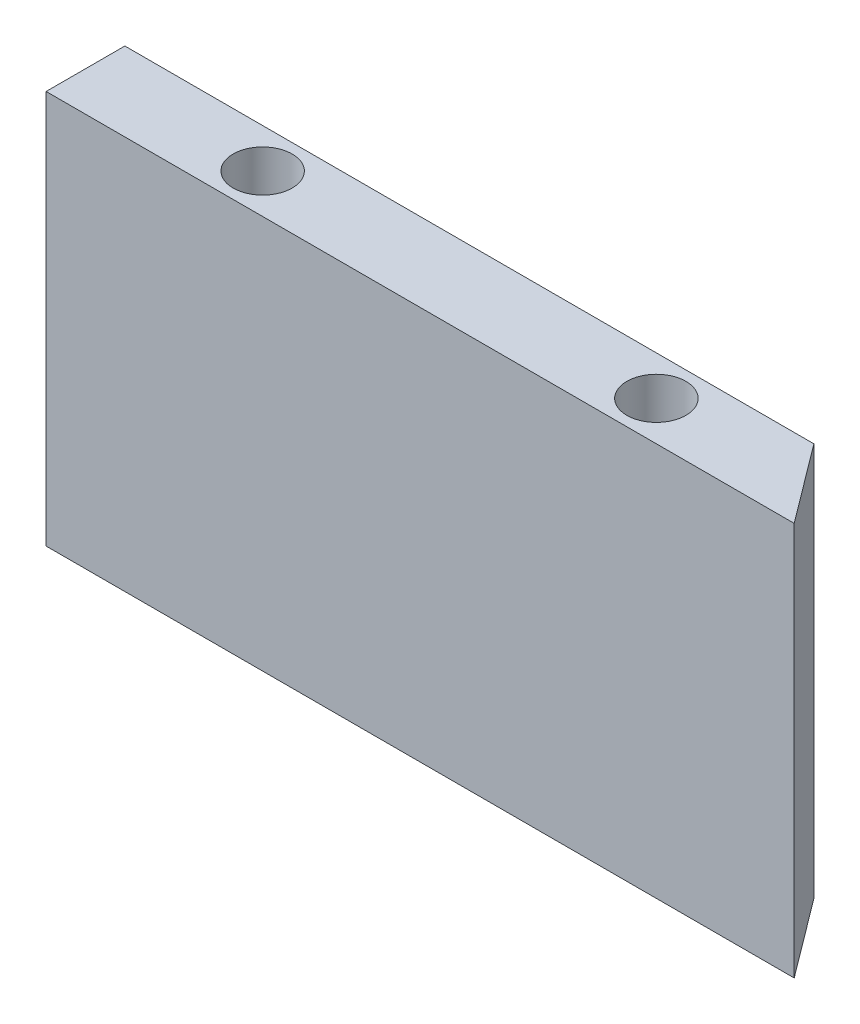
ISO-10303-21;
HEADER;
FILE_DESCRIPTION(('STEP AP214'),'2;1');
FILE_NAME('part.step','',(''),(''),'','','');
FILE_SCHEMA(('AUTOMOTIVE_DESIGN { 1 0 10303 214 1 1 1 1 }'));
ENDSEC;
DATA;
#1=APPLICATION_CONTEXT('core data for automotive mechanical design processes');
#2=APPLICATION_PROTOCOL_DEFINITION('international standard','automotive_design',2000,#1);
#3=PRODUCT_CONTEXT('',#1,'mechanical');
#4=PRODUCT('Part','Part','',(#3));
#5=PRODUCT_RELATED_PRODUCT_CATEGORY('part','',(#4));
#6=PRODUCT_DEFINITION_FORMATION('','',#4);
#7=PRODUCT_DEFINITION_CONTEXT('part definition',#1,'design');
#8=PRODUCT_DEFINITION('design','',#6,#7);
#9=PRODUCT_DEFINITION_SHAPE('','',#8);
#10=(LENGTH_UNIT() NAMED_UNIT(*) SI_UNIT(.MILLI.,.METRE.));
#11=(NAMED_UNIT(*) PLANE_ANGLE_UNIT() SI_UNIT($,.RADIAN.));
#12=(NAMED_UNIT(*) SI_UNIT($,.STERADIAN.) SOLID_ANGLE_UNIT());
#13=UNCERTAINTY_MEASURE_WITH_UNIT(LENGTH_MEASURE(1.E-05),#10,'distance_accuracy_value','');
#14=(GEOMETRIC_REPRESENTATION_CONTEXT(3) GLOBAL_UNCERTAINTY_ASSIGNED_CONTEXT((#13)) GLOBAL_UNIT_ASSIGNED_CONTEXT((#10,
#11,#12)) REPRESENTATION_CONTEXT('',''));
#15=CARTESIAN_POINT('',(0.,0.,0.));
#16=DIRECTION('',(0.,0.,1.));
#17=DIRECTION('',(1.,0.,0.));
#18=AXIS2_PLACEMENT_3D('',#15,#16,#17);
#19=CARTESIAN_POINT('',(424.562385163869,508.,-50.8000000000001));
#20=DIRECTION('',(0.800000000000001,0.,-0.599999999999999));
#21=DIRECTION('',(-0.599999999999999,0.,-0.800000000000001));
#22=AXIS2_PLACEMENT_3D('',#19,#20,#21);
#23=PLANE('',#22);
#24=DIRECTION('',(0.599999999999999,0.,0.800000000000001));
#25=VECTOR('',#24,1.);
#26=CARTESIAN_POINT('',(424.562385163869,0.,-50.8000000000001));
#27=LINE('',#26,#25);
#28=CARTESIAN_POINT('',(424.562385163869,0.,-50.8000000000001));
#29=VERTEX_POINT('',#28);
#30=CARTESIAN_POINT('',(500.762385163869,0.,50.8000000000002));
#31=VERTEX_POINT('',#30);
#32=EDGE_CURVE('E110',#29,#31,#27,.T.);
#33=ORIENTED_EDGE('',*,*,#32,.F.);
#34=DIRECTION('',(0.,-1.,0.));
#35=VECTOR('',#34,1.);
#36=CARTESIAN_POINT('',(424.562385163869,508.,-50.8000000000001));
#37=LINE('',#36,#35);
#38=CARTESIAN_POINT('',(424.562385163869,508.,-50.8000000000001));
#39=VERTEX_POINT('',#38);
#40=EDGE_CURVE('E11',#39,#29,#37,.T.);
#41=ORIENTED_EDGE('',*,*,#40,.F.);
#42=DIRECTION('',(0.599999999999999,0.,0.800000000000001));
#43=VECTOR('',#42,1.);
#44=CARTESIAN_POINT('',(424.562385163869,508.,-50.8000000000001));
#45=LINE('',#44,#43);
#46=CARTESIAN_POINT('',(500.762385163869,508.,50.8000000000002));
#47=VERTEX_POINT('',#46);
#48=EDGE_CURVE('E101',#39,#47,#45,.T.);
#49=ORIENTED_EDGE('',*,*,#48,.T.);
#50=DIRECTION('',(0.,-1.,0.));
#51=VECTOR('',#50,1.);
#52=CARTESIAN_POINT('',(500.762385163869,508.,50.8000000000002));
#53=LINE('',#52,#51);
#54=EDGE_CURVE('E42',#47,#31,#53,.T.);
#55=ORIENTED_EDGE('',*,*,#54,.T.);
#56=EDGE_LOOP('',(#33,#41,#49,#55));
#57=FACE_BOUND('',#56,.T.);
#58=ADVANCED_FACE('F39',(#57),#23,.T.);
#59=CARTESIAN_POINT('',(-464.437614836131,508.,-50.8));
#60=DIRECTION('',(0.,0.,-1.));
#61=DIRECTION('',(-1.,0.,0.));
#62=AXIS2_PLACEMENT_3D('',#59,#60,#61);
#63=PLANE('',#62);
#64=DIRECTION('',(1.,0.,0.));
#65=VECTOR('',#64,1.);
#66=CARTESIAN_POINT('',(-464.437614836131,0.,-50.8));
#67=LINE('',#66,#65);
#68=CARTESIAN_POINT('',(-464.437614836131,0.,-50.8));
#69=VERTEX_POINT('',#68);
#70=EDGE_CURVE('E104',#69,#29,#67,.T.);
#71=ORIENTED_EDGE('',*,*,#70,.F.);
#72=DIRECTION('',(0.,-1.,0.));
#73=VECTOR('',#72,1.);
#74=CARTESIAN_POINT('',(-464.437614836131,508.,-50.8));
#75=LINE('',#74,#73);
#76=CARTESIAN_POINT('',(-464.437614836131,508.,-50.8));
#77=VERTEX_POINT('',#76);
#78=EDGE_CURVE('E49',#77,#69,#75,.T.);
#79=ORIENTED_EDGE('',*,*,#78,.F.);
#80=DIRECTION('',(1.,0.,0.));
#81=VECTOR('',#80,1.);
#82=CARTESIAN_POINT('',(-464.437614836131,508.,-50.8));
#83=LINE('',#82,#81);
#84=EDGE_CURVE('E96',#77,#39,#83,.T.);
#85=ORIENTED_EDGE('',*,*,#84,.T.);
#86=ORIENTED_EDGE('',*,*,#40,.T.);
#87=EDGE_LOOP('',(#71,#79,#85,#86));
#88=FACE_BOUND('',#87,.T.);
#89=ADVANCED_FACE('F127',(#88),#63,.T.);
#90=CARTESIAN_POINT('',(-464.437614836131,508.,50.8000000000002));
#91=DIRECTION('',(-1.,0.,0.));
#92=DIRECTION('',(0.,0.,1.));
#93=AXIS2_PLACEMENT_3D('',#90,#91,#92);
#94=PLANE('',#93);
#95=DIRECTION('',(0.,0.,-1.));
#96=VECTOR('',#95,1.);
#97=CARTESIAN_POINT('',(-464.437614836131,0.,50.8000000000002));
#98=LINE('',#97,#96);
#99=CARTESIAN_POINT('',(-464.437614836131,0.,50.8000000000002));
#100=VERTEX_POINT('',#99);
#101=EDGE_CURVE('E90',#100,#69,#98,.T.);
#102=ORIENTED_EDGE('',*,*,#101,.F.);
#103=DIRECTION('',(0.,-1.,0.));
#104=VECTOR('',#103,1.);
#105=CARTESIAN_POINT('',(-464.437614836131,508.,50.8000000000002));
#106=LINE('',#105,#104);
#107=CARTESIAN_POINT('',(-464.437614836131,508.,50.8000000000002));
#108=VERTEX_POINT('',#107);
#109=EDGE_CURVE('E85',#108,#100,#106,.T.);
#110=ORIENTED_EDGE('',*,*,#109,.F.);
#111=DIRECTION('',(0.,0.,-1.));
#112=VECTOR('',#111,1.);
#113=CARTESIAN_POINT('',(-464.437614836131,508.,50.8000000000002));
#114=LINE('',#113,#112);
#115=EDGE_CURVE('E88',#108,#77,#114,.T.);
#116=ORIENTED_EDGE('',*,*,#115,.T.);
#117=ORIENTED_EDGE('',*,*,#78,.T.);
#118=EDGE_LOOP('',(#102,#110,#116,#117));
#119=FACE_BOUND('',#118,.T.);
#120=ADVANCED_FACE('F87',(#119),#94,.T.);
#121=CARTESIAN_POINT('',(500.762385163869,508.,50.8000000000002));
#122=DIRECTION('',(0.,0.,1.));
#123=DIRECTION('',(1.,0.,0.));
#124=AXIS2_PLACEMENT_3D('',#121,#122,#123);
#125=PLANE('',#124);
#126=DIRECTION('',(-1.,0.,0.));
#127=VECTOR('',#126,1.);
#128=CARTESIAN_POINT('',(500.762385163869,0.,50.8000000000002));
#129=LINE('',#128,#127);
#130=EDGE_CURVE('E114',#31,#100,#129,.T.);
#131=ORIENTED_EDGE('',*,*,#130,.F.);
#132=ORIENTED_EDGE('',*,*,#54,.F.);
#133=DIRECTION('',(-1.,0.,0.));
#134=VECTOR('',#133,1.);
#135=CARTESIAN_POINT('',(500.762385163869,508.,50.8000000000002));
#136=LINE('',#135,#134);
#137=EDGE_CURVE('E95',#47,#108,#136,.T.);
#138=ORIENTED_EDGE('',*,*,#137,.T.);
#139=ORIENTED_EDGE('',*,*,#109,.T.);
#140=EDGE_LOOP('',(#131,#132,#138,#139));
#141=FACE_BOUND('',#140,.T.);
#142=ADVANCED_FACE('F99',(#141),#125,.T.);
#143=CARTESIAN_POINT('',(0.,508.,0.));
#144=DIRECTION('',(0.,-1.,0.));
#145=DIRECTION('',(0.,0.,-1.));
#146=AXIS2_PLACEMENT_3D('',#143,#144,#145);
#147=PLANE('',#146);
#148=CARTESIAN_POINT('',(-235.837614836131,508.,0.));
#149=DIRECTION('',(0.,1.,0.));
#150=DIRECTION('',(0.,0.,1.));
#151=AXIS2_PLACEMENT_3D('',#148,#149,#150);
#152=CIRCLE('',#151,38.1);
#153=CARTESIAN_POINT('',(-235.837614836131,508.,38.1));
#154=VERTEX_POINT('',#153);
#155=EDGE_CURVE('E207',#154,#154,#152,.T.);
#156=ORIENTED_EDGE('',*,*,#155,.F.);
#157=EDGE_LOOP('',(#156));
#158=FACE_BOUND('',#157,.T.);
#159=CARTESIAN_POINT('',(272.162385163869,508.,0.));
#160=DIRECTION('',(0.,1.,0.));
#161=DIRECTION('',(0.,0.,1.));
#162=AXIS2_PLACEMENT_3D('',#159,#160,#161);
#163=CIRCLE('',#162,38.1);
#164=CARTESIAN_POINT('',(272.162385163869,508.,38.1));
#165=VERTEX_POINT('',#164);
#166=EDGE_CURVE('E186',#165,#165,#163,.T.);
#167=ORIENTED_EDGE('',*,*,#166,.F.);
#168=EDGE_LOOP('',(#167));
#169=FACE_BOUND('',#168,.T.);
#170=ORIENTED_EDGE('',*,*,#48,.F.);
#171=ORIENTED_EDGE('',*,*,#84,.F.);
#172=ORIENTED_EDGE('',*,*,#115,.F.);
#173=ORIENTED_EDGE('',*,*,#137,.F.);
#174=EDGE_LOOP('',(#170,#171,#172,#173));
#175=FACE_BOUND('',#174,.T.);
#176=ADVANCED_FACE('F94',(#158,#169,#175),#147,.F.);
#177=CARTESIAN_POINT('',(0.,0.,0.));
#178=DIRECTION('',(0.,-1.,0.));
#179=DIRECTION('',(0.,0.,-1.));
#180=AXIS2_PLACEMENT_3D('',#177,#178,#179);
#181=PLANE('',#180);
#182=CARTESIAN_POINT('',(-235.837614836131,0.,0.));
#183=DIRECTION('',(0.,-1.,0.));
#184=DIRECTION('',(0.,0.,-1.));
#185=AXIS2_PLACEMENT_3D('',#182,#183,#184);
#186=CIRCLE('',#185,40.8522279785418);
#187=CARTESIAN_POINT('',(-235.837614836131,0.,-40.8522279785418));
#188=VERTEX_POINT('',#187);
#189=EDGE_CURVE('E187',#188,#188,#186,.T.);
#190=ORIENTED_EDGE('',*,*,#189,.F.);
#191=EDGE_LOOP('',(#190));
#192=FACE_BOUND('',#191,.T.);
#193=CARTESIAN_POINT('',(272.162385163869,0.,0.));
#194=DIRECTION('',(0.,-1.,0.));
#195=DIRECTION('',(0.,0.,-1.));
#196=AXIS2_PLACEMENT_3D('',#193,#194,#195);
#197=CIRCLE('',#196,38.7021107165133);
#198=CARTESIAN_POINT('',(272.162385163869,0.,-38.7021107165133));
#199=VERTEX_POINT('',#198);
#200=EDGE_CURVE('E200',#199,#199,#197,.T.);
#201=ORIENTED_EDGE('',*,*,#200,.F.);
#202=EDGE_LOOP('',(#201));
#203=FACE_BOUND('',#202,.T.);
#204=ORIENTED_EDGE('',*,*,#32,.T.);
#205=ORIENTED_EDGE('',*,*,#130,.T.);
#206=ORIENTED_EDGE('',*,*,#101,.T.);
#207=ORIENTED_EDGE('',*,*,#70,.T.);
#208=EDGE_LOOP('',(#204,#205,#206,#207));
#209=FACE_BOUND('',#208,.T.);
#210=ADVANCED_FACE('F126',(#192,#203,#209),#181,.T.);
#211=CARTESIAN_POINT('',(272.162385163869,381.,0.));
#212=DIRECTION('',(0.,1.,0.));
#213=DIRECTION('',(0.,0.,1.));
#214=AXIS2_PLACEMENT_3D('',#211,#212,#213);
#215=CYLINDRICAL_SURFACE('',#214,38.1);
#216=CARTESIAN_POINT('',(272.162385163869,381.,0.));
#217=DIRECTION('',(0.,1.,0.));
#218=DIRECTION('',(0.,0.,1.));
#219=AXIS2_PLACEMENT_3D('',#216,#217,#218);
#220=CIRCLE('',#219,38.1);
#221=CARTESIAN_POINT('',(272.162385163869,381.,38.1));
#222=VERTEX_POINT('',#221);
#223=EDGE_CURVE('E192',#222,#222,#220,.T.);
#224=ORIENTED_EDGE('',*,*,#223,.F.);
#225=EDGE_LOOP('',(#224));
#226=FACE_BOUND('',#225,.T.);
#227=ORIENTED_EDGE('',*,*,#166,.T.);
#228=EDGE_LOOP('',(#227));
#229=FACE_BOUND('',#228,.T.);
#230=ADVANCED_FACE('F145',(#226,#229),#215,.F.);
#231=CARTESIAN_POINT('',(272.162385163869,381.,0.));
#232=DIRECTION('',(0.,1.,0.));
#233=DIRECTION('',(0.,0.,1.));
#234=AXIS2_PLACEMENT_3D('',#231,#232,#233);
#235=PLANE('',#234);
#236=ORIENTED_EDGE('',*,*,#223,.T.);
#237=EDGE_LOOP('',(#236));
#238=FACE_BOUND('',#237,.T.);
#239=ADVANCED_FACE('F152',(#238),#235,.T.);
#240=CARTESIAN_POINT('',(-235.837614836131,381.,0.));
#241=DIRECTION('',(0.,1.,0.));
#242=DIRECTION('',(0.,0.,1.));
#243=AXIS2_PLACEMENT_3D('',#240,#241,#242);
#244=CYLINDRICAL_SURFACE('',#243,38.1);
#245=CARTESIAN_POINT('',(-235.837614836131,381.,0.));
#246=DIRECTION('',(0.,1.,0.));
#247=DIRECTION('',(0.,0.,1.));
#248=AXIS2_PLACEMENT_3D('',#245,#246,#247);
#249=CIRCLE('',#248,38.1);
#250=CARTESIAN_POINT('',(-235.837614836131,381.,38.1));
#251=VERTEX_POINT('',#250);
#252=EDGE_CURVE('E115',#251,#251,#249,.T.);
#253=ORIENTED_EDGE('',*,*,#252,.F.);
#254=EDGE_LOOP('',(#253));
#255=FACE_BOUND('',#254,.T.);
#256=ORIENTED_EDGE('',*,*,#155,.T.);
#257=EDGE_LOOP('',(#256));
#258=FACE_BOUND('',#257,.T.);
#259=ADVANCED_FACE('F156',(#255,#258),#244,.F.);
#260=CARTESIAN_POINT('',(-235.837614836131,381.,0.));
#261=DIRECTION('',(0.,1.,0.));
#262=DIRECTION('',(0.,0.,1.));
#263=AXIS2_PLACEMENT_3D('',#260,#261,#262);
#264=PLANE('',#263);
#265=ORIENTED_EDGE('',*,*,#252,.T.);
#266=EDGE_LOOP('',(#265));
#267=FACE_BOUND('',#266,.T.);
#268=ADVANCED_FACE('F160',(#267),#264,.T.);
#269=CARTESIAN_POINT('',(272.162385163869,127.,0.));
#270=DIRECTION('',(0.,-1.,0.));
#271=DIRECTION('',(0.,0.,-1.));
#272=AXIS2_PLACEMENT_3D('',#269,#270,#271);
#273=CYLINDRICAL_SURFACE('',#272,38.7021107165133);
#274=CARTESIAN_POINT('',(272.162385163869,127.,0.));
#275=DIRECTION('',(0.,-1.,0.));
#276=DIRECTION('',(0.,0.,-1.));
#277=AXIS2_PLACEMENT_3D('',#274,#275,#276);
#278=CIRCLE('',#277,38.7021107165133);
#279=CARTESIAN_POINT('',(272.162385163869,127.,-38.7021107165133));
#280=VERTEX_POINT('',#279);
#281=EDGE_CURVE('E194',#280,#280,#278,.T.);
#282=ORIENTED_EDGE('',*,*,#281,.F.);
#283=EDGE_LOOP('',(#282));
#284=FACE_BOUND('',#283,.T.);
#285=ORIENTED_EDGE('',*,*,#200,.T.);
#286=EDGE_LOOP('',(#285));
#287=FACE_BOUND('',#286,.T.);
#288=ADVANCED_FACE('F164',(#284,#287),#273,.F.);
#289=CARTESIAN_POINT('',(272.162385163869,127.,0.));
#290=DIRECTION('',(0.,-1.,0.));
#291=DIRECTION('',(0.,0.,-1.));
#292=AXIS2_PLACEMENT_3D('',#289,#290,#291);
#293=PLANE('',#292);
#294=ORIENTED_EDGE('',*,*,#281,.T.);
#295=EDGE_LOOP('',(#294));
#296=FACE_BOUND('',#295,.T.);
#297=ADVANCED_FACE('F168',(#296),#293,.T.);
#298=CARTESIAN_POINT('',(-235.837614836131,127.,0.));
#299=DIRECTION('',(0.,-1.,0.));
#300=DIRECTION('',(0.,0.,-1.));
#301=AXIS2_PLACEMENT_3D('',#298,#299,#300);
#302=CYLINDRICAL_SURFACE('',#301,40.8522279785418);
#303=CARTESIAN_POINT('',(-235.837614836131,127.,0.));
#304=DIRECTION('',(0.,-1.,0.));
#305=DIRECTION('',(0.,0.,-1.));
#306=AXIS2_PLACEMENT_3D('',#303,#304,#305);
#307=CIRCLE('',#306,40.8522279785418);
#308=CARTESIAN_POINT('',(-235.837614836131,127.,-40.8522279785418));
#309=VERTEX_POINT('',#308);
#310=EDGE_CURVE('E184',#309,#309,#307,.T.);
#311=ORIENTED_EDGE('',*,*,#310,.F.);
#312=EDGE_LOOP('',(#311));
#313=FACE_BOUND('',#312,.T.);
#314=ORIENTED_EDGE('',*,*,#189,.T.);
#315=EDGE_LOOP('',(#314));
#316=FACE_BOUND('',#315,.T.);
#317=ADVANCED_FACE('F172',(#313,#316),#302,.F.);
#318=CARTESIAN_POINT('',(-235.837614836131,127.,0.));
#319=DIRECTION('',(0.,-1.,0.));
#320=DIRECTION('',(0.,0.,-1.));
#321=AXIS2_PLACEMENT_3D('',#318,#319,#320);
#322=PLANE('',#321);
#323=ORIENTED_EDGE('',*,*,#310,.T.);
#324=EDGE_LOOP('',(#323));
#325=FACE_BOUND('',#324,.T.);
#326=ADVANCED_FACE('F176',(#325),#322,.T.);
#327=CLOSED_SHELL('',(#58,#89,#120,#142,#176,#210,#230,#239,#259,#268,#288,#297,#317,#326));
#328=MANIFOLD_SOLID_BREP('B2',#327);
#329=ADVANCED_BREP_SHAPE_REPRESENTATION('',(#18,#328),#14);
#330=SHAPE_DEFINITION_REPRESENTATION(#9,#329);
ENDSEC;
END-ISO-10303-21;
